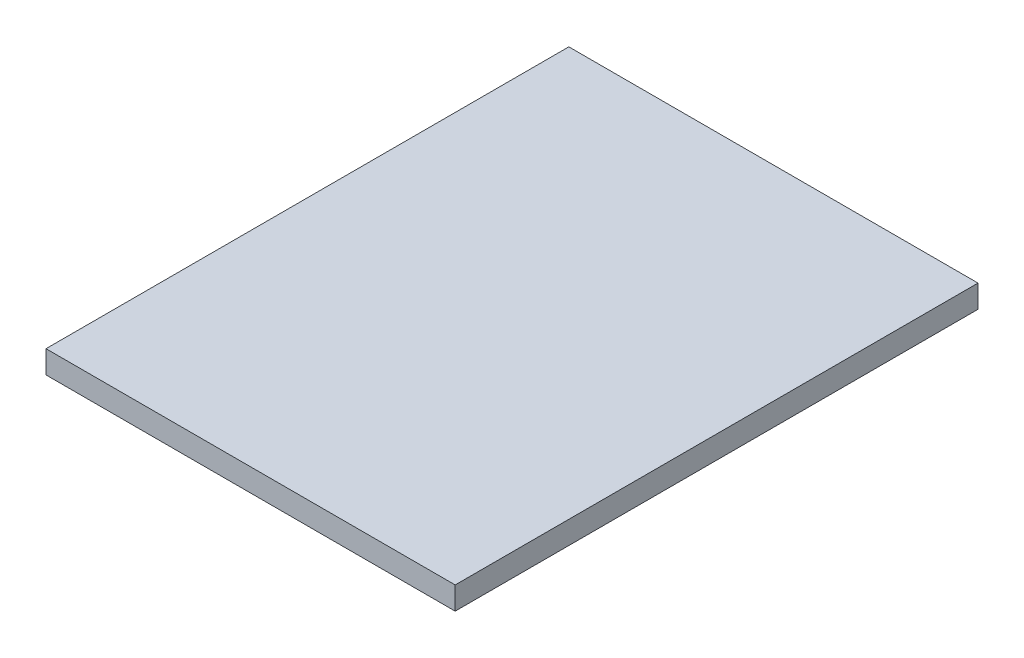
ISO-10303-21;
HEADER;
FILE_DESCRIPTION(('STEP AP214'),'2;1');
FILE_NAME('part.step','',(''),(''),'','','');
FILE_SCHEMA(('AUTOMOTIVE_DESIGN { 1 0 10303 214 1 1 1 1 }'));
ENDSEC;
DATA;
#1=APPLICATION_CONTEXT('core data for automotive mechanical design processes');
#2=APPLICATION_PROTOCOL_DEFINITION('international standard','automotive_design',2000,#1);
#3=PRODUCT_CONTEXT('',#1,'mechanical');
#4=PRODUCT('Part','Part','',(#3));
#5=PRODUCT_RELATED_PRODUCT_CATEGORY('part','',(#4));
#6=PRODUCT_DEFINITION_FORMATION('','',#4);
#7=PRODUCT_DEFINITION_CONTEXT('part definition',#1,'design');
#8=PRODUCT_DEFINITION('design','',#6,#7);
#9=PRODUCT_DEFINITION_SHAPE('','',#8);
#10=(LENGTH_UNIT() NAMED_UNIT(*) SI_UNIT(.MILLI.,.METRE.));
#11=(NAMED_UNIT(*) PLANE_ANGLE_UNIT() SI_UNIT($,.RADIAN.));
#12=(NAMED_UNIT(*) SI_UNIT($,.STERADIAN.) SOLID_ANGLE_UNIT());
#13=UNCERTAINTY_MEASURE_WITH_UNIT(LENGTH_MEASURE(1.E-05),#10,'distance_accuracy_value','');
#14=(GEOMETRIC_REPRESENTATION_CONTEXT(3) GLOBAL_UNCERTAINTY_ASSIGNED_CONTEXT((#13)) GLOBAL_UNIT_ASSIGNED_CONTEXT((#10,
#11,#12)) REPRESENTATION_CONTEXT('',''));
#15=CARTESIAN_POINT('',(0.,0.,0.));
#16=DIRECTION('',(0.,0.,1.));
#17=DIRECTION('',(1.,0.,0.));
#18=AXIS2_PLACEMENT_3D('',#15,#16,#17);
#19=CARTESIAN_POINT('',(9.,1.,-11.5));
#20=DIRECTION('',(-1.,0.,0.));
#21=DIRECTION('',(0.,0.,1.));
#22=AXIS2_PLACEMENT_3D('',#19,#20,#21);
#23=PLANE('',#22);
#24=DIRECTION('',(0.,0.,-1.));
#25=VECTOR('',#24,1.);
#26=CARTESIAN_POINT('',(9.,0.,-11.5));
#27=LINE('',#26,#25);
#28=CARTESIAN_POINT('',(9.,0.,11.5));
#29=VERTEX_POINT('',#28);
#30=CARTESIAN_POINT('',(9.,0.,-11.5));
#31=VERTEX_POINT('',#30);
#32=EDGE_CURVE('E96',#29,#31,#27,.T.);
#33=ORIENTED_EDGE('',*,*,#32,.T.);
#34=DIRECTION('',(0.,-1.,0.));
#35=VECTOR('',#34,1.);
#36=CARTESIAN_POINT('',(9.,1.,-11.5));
#37=LINE('',#36,#35);
#38=CARTESIAN_POINT('',(9.,1.,-11.5));
#39=VERTEX_POINT('',#38);
#40=EDGE_CURVE('E11',#39,#31,#37,.T.);
#41=ORIENTED_EDGE('',*,*,#40,.F.);
#42=DIRECTION('',(0.,0.,-1.));
#43=VECTOR('',#42,1.);
#44=CARTESIAN_POINT('',(9.,1.,-11.5));
#45=LINE('',#44,#43);
#46=CARTESIAN_POINT('',(9.,1.,11.5));
#47=VERTEX_POINT('',#46);
#48=EDGE_CURVE('E84',#47,#39,#45,.T.);
#49=ORIENTED_EDGE('',*,*,#48,.F.);
#50=DIRECTION('',(0.,-1.,0.));
#51=VECTOR('',#50,1.);
#52=CARTESIAN_POINT('',(9.,1.,11.5));
#53=LINE('',#52,#51);
#54=EDGE_CURVE('E92',#47,#29,#53,.T.);
#55=ORIENTED_EDGE('',*,*,#54,.T.);
#56=EDGE_LOOP('',(#33,#41,#49,#55));
#57=FACE_BOUND('',#56,.T.);
#58=ADVANCED_FACE('F33',(#57),#23,.F.);
#59=CARTESIAN_POINT('',(-9.,1.,-11.5));
#60=DIRECTION('',(0.,0.,1.));
#61=DIRECTION('',(1.,0.,0.));
#62=AXIS2_PLACEMENT_3D('',#59,#60,#61);
#63=PLANE('',#62);
#64=DIRECTION('',(-1.,0.,0.));
#65=VECTOR('',#64,1.);
#66=CARTESIAN_POINT('',(-9.,0.,-11.5));
#67=LINE('',#66,#65);
#68=CARTESIAN_POINT('',(-9.,0.,-11.5));
#69=VERTEX_POINT('',#68);
#70=EDGE_CURVE('E88',#31,#69,#67,.T.);
#71=ORIENTED_EDGE('',*,*,#70,.T.);
#72=DIRECTION('',(0.,-1.,0.));
#73=VECTOR('',#72,1.);
#74=CARTESIAN_POINT('',(-9.,1.,-11.5));
#75=LINE('',#74,#73);
#76=CARTESIAN_POINT('',(-9.,1.,-11.5));
#77=VERTEX_POINT('',#76);
#78=EDGE_CURVE('E41',#77,#69,#75,.T.);
#79=ORIENTED_EDGE('',*,*,#78,.F.);
#80=DIRECTION('',(-1.,0.,0.));
#81=VECTOR('',#80,1.);
#82=CARTESIAN_POINT('',(-9.,1.,-11.5));
#83=LINE('',#82,#81);
#84=EDGE_CURVE('E79',#39,#77,#83,.T.);
#85=ORIENTED_EDGE('',*,*,#84,.F.);
#86=ORIENTED_EDGE('',*,*,#40,.T.);
#87=EDGE_LOOP('',(#71,#79,#85,#86));
#88=FACE_BOUND('',#87,.T.);
#89=ADVANCED_FACE('F87',(#88),#63,.F.);
#90=CARTESIAN_POINT('',(-9.,1.,-11.5));
#91=DIRECTION('',(1.,0.,0.));
#92=DIRECTION('',(0.,0.,-1.));
#93=AXIS2_PLACEMENT_3D('',#90,#91,#92);
#94=PLANE('',#93);
#95=DIRECTION('',(0.,0.,1.));
#96=VECTOR('',#95,1.);
#97=CARTESIAN_POINT('',(-9.,0.,-11.5));
#98=LINE('',#97,#96);
#99=CARTESIAN_POINT('',(-9.,0.,11.5));
#100=VERTEX_POINT('',#99);
#101=EDGE_CURVE('E66',#69,#100,#98,.T.);
#102=ORIENTED_EDGE('',*,*,#101,.T.);
#103=DIRECTION('',(0.,-1.,0.));
#104=VECTOR('',#103,1.);
#105=CARTESIAN_POINT('',(-9.,1.,11.5));
#106=LINE('',#105,#104);
#107=CARTESIAN_POINT('',(-9.,1.,11.5));
#108=VERTEX_POINT('',#107);
#109=EDGE_CURVE('E89',#108,#100,#106,.T.);
#110=ORIENTED_EDGE('',*,*,#109,.F.);
#111=DIRECTION('',(0.,0.,1.));
#112=VECTOR('',#111,1.);
#113=CARTESIAN_POINT('',(-9.,1.,-11.5));
#114=LINE('',#113,#112);
#115=EDGE_CURVE('E82',#77,#108,#114,.T.);
#116=ORIENTED_EDGE('',*,*,#115,.F.);
#117=ORIENTED_EDGE('',*,*,#78,.T.);
#118=EDGE_LOOP('',(#102,#110,#116,#117));
#119=FACE_BOUND('',#118,.T.);
#120=ADVANCED_FACE('F90',(#119),#94,.F.);
#121=CARTESIAN_POINT('',(-9.,1.,11.5));
#122=DIRECTION('',(0.,0.,-1.));
#123=DIRECTION('',(-1.,0.,0.));
#124=AXIS2_PLACEMENT_3D('',#121,#122,#123);
#125=PLANE('',#124);
#126=DIRECTION('',(1.,0.,0.));
#127=VECTOR('',#126,1.);
#128=CARTESIAN_POINT('',(-9.,0.,11.5));
#129=LINE('',#128,#127);
#130=EDGE_CURVE('E72',#100,#29,#129,.T.);
#131=ORIENTED_EDGE('',*,*,#130,.T.);
#132=ORIENTED_EDGE('',*,*,#54,.F.);
#133=DIRECTION('',(1.,0.,0.));
#134=VECTOR('',#133,1.);
#135=CARTESIAN_POINT('',(-9.,1.,11.5));
#136=LINE('',#135,#134);
#137=EDGE_CURVE('E49',#108,#47,#136,.T.);
#138=ORIENTED_EDGE('',*,*,#137,.F.);
#139=ORIENTED_EDGE('',*,*,#109,.T.);
#140=EDGE_LOOP('',(#131,#132,#138,#139));
#141=FACE_BOUND('',#140,.T.);
#142=ADVANCED_FACE('F103',(#141),#125,.F.);
#143=CARTESIAN_POINT('',(0.,1.,0.));
#144=DIRECTION('',(0.,1.,0.));
#145=DIRECTION('',(0.,0.,1.));
#146=AXIS2_PLACEMENT_3D('',#143,#144,#145);
#147=PLANE('',#146);
#148=ORIENTED_EDGE('',*,*,#48,.T.);
#149=ORIENTED_EDGE('',*,*,#84,.T.);
#150=ORIENTED_EDGE('',*,*,#115,.T.);
#151=ORIENTED_EDGE('',*,*,#137,.T.);
#152=EDGE_LOOP('',(#148,#149,#150,#151));
#153=FACE_BOUND('',#152,.T.);
#154=ADVANCED_FACE('F80',(#153),#147,.T.);
#155=CARTESIAN_POINT('',(0.,0.,0.));
#156=DIRECTION('',(0.,1.,0.));
#157=DIRECTION('',(0.,0.,1.));
#158=AXIS2_PLACEMENT_3D('',#155,#156,#157);
#159=PLANE('',#158);
#160=ORIENTED_EDGE('',*,*,#32,.F.);
#161=ORIENTED_EDGE('',*,*,#130,.F.);
#162=ORIENTED_EDGE('',*,*,#101,.F.);
#163=ORIENTED_EDGE('',*,*,#70,.F.);
#164=EDGE_LOOP('',(#160,#161,#162,#163));
#165=FACE_BOUND('',#164,.T.);
#166=ADVANCED_FACE('F106',(#165),#159,.F.);
#167=CLOSED_SHELL('',(#58,#89,#120,#142,#154,#166));
#168=MANIFOLD_SOLID_BREP('B2',#167);
#169=ADVANCED_BREP_SHAPE_REPRESENTATION('',(#18,#168),#14);
#170=SHAPE_DEFINITION_REPRESENTATION(#9,#169);
ENDSEC;
END-ISO-10303-21;
